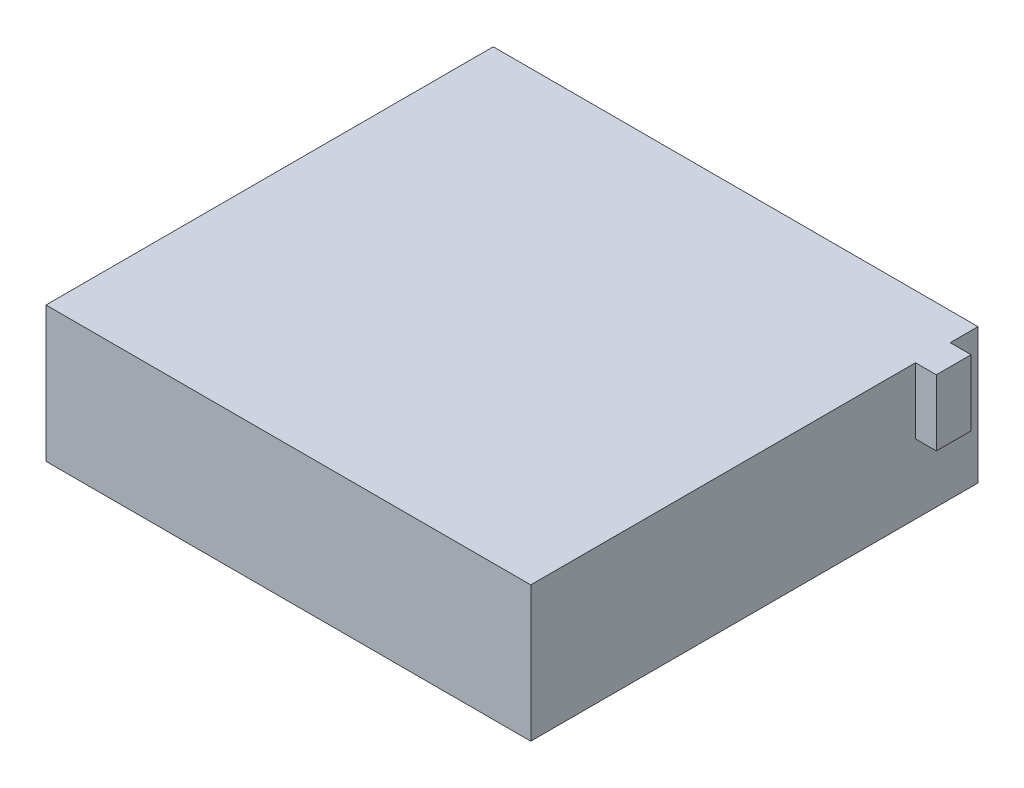
ISO-10303-21;
HEADER;
FILE_DESCRIPTION(('STEP AP214'),'2;1');
FILE_NAME('part.step','',(''),(''),'','','');
FILE_SCHEMA(('AUTOMOTIVE_DESIGN { 1 0 10303 214 1 1 1 1 }'));
ENDSEC;
DATA;
#1=APPLICATION_CONTEXT('core data for automotive mechanical design processes');
#2=APPLICATION_PROTOCOL_DEFINITION('international standard','automotive_design',2000,#1);
#3=PRODUCT_CONTEXT('',#1,'mechanical');
#4=PRODUCT('Part','Part','',(#3));
#5=PRODUCT_RELATED_PRODUCT_CATEGORY('part','',(#4));
#6=PRODUCT_DEFINITION_FORMATION('','',#4);
#7=PRODUCT_DEFINITION_CONTEXT('part definition',#1,'design');
#8=PRODUCT_DEFINITION('design','',#6,#7);
#9=PRODUCT_DEFINITION_SHAPE('','',#8);
#10=(LENGTH_UNIT() NAMED_UNIT(*) SI_UNIT(.MILLI.,.METRE.));
#11=(NAMED_UNIT(*) PLANE_ANGLE_UNIT() SI_UNIT($,.RADIAN.));
#12=(NAMED_UNIT(*) SI_UNIT($,.STERADIAN.) SOLID_ANGLE_UNIT());
#13=UNCERTAINTY_MEASURE_WITH_UNIT(LENGTH_MEASURE(1.E-05),#10,'distance_accuracy_value','');
#14=(GEOMETRIC_REPRESENTATION_CONTEXT(3) GLOBAL_UNCERTAINTY_ASSIGNED_CONTEXT((#13)) GLOBAL_UNIT_ASSIGNED_CONTEXT((#10,
#11,#12)) REPRESENTATION_CONTEXT('',''));
#15=CARTESIAN_POINT('',(0.,0.,0.));
#16=DIRECTION('',(0.,0.,1.));
#17=DIRECTION('',(1.,0.,0.));
#18=AXIS2_PLACEMENT_3D('',#15,#16,#17);
#19=CARTESIAN_POINT('',(34.9,19.5,-32.2));
#20=DIRECTION('',(-1.,0.,0.));
#21=DIRECTION('',(0.,0.,1.));
#22=AXIS2_PLACEMENT_3D('',#19,#20,#21);
#23=PLANE('',#22);
#24=DIRECTION('',(0.,-1.,0.));
#25=VECTOR('',#24,1.);
#26=CARTESIAN_POINT('',(34.9,19.5,-23.2));
#27=LINE('',#26,#25);
#28=CARTESIAN_POINT('',(34.9,19.5,-23.2));
#29=VERTEX_POINT('',#28);
#30=CARTESIAN_POINT('',(34.9,10.,-23.2));
#31=VERTEX_POINT('',#30);
#32=EDGE_CURVE('E127',#29,#31,#27,.T.);
#33=ORIENTED_EDGE('',*,*,#32,.F.);
#34=DIRECTION('',(0.,0.,-1.));
#35=VECTOR('',#34,1.);
#36=CARTESIAN_POINT('',(34.9,19.5,-32.2));
#37=LINE('',#36,#35);
#38=CARTESIAN_POINT('',(34.9,19.5,32.2));
#39=VERTEX_POINT('',#38);
#40=EDGE_CURVE('E137',#39,#29,#37,.T.);
#41=ORIENTED_EDGE('',*,*,#40,.F.);
#42=DIRECTION('',(0.,-1.,0.));
#43=VECTOR('',#42,1.);
#44=CARTESIAN_POINT('',(34.9,19.5,32.2));
#45=LINE('',#44,#43);
#46=CARTESIAN_POINT('',(34.9,0.,32.2));
#47=VERTEX_POINT('',#46);
#48=EDGE_CURVE('E145',#39,#47,#45,.T.);
#49=ORIENTED_EDGE('',*,*,#48,.T.);
#50=DIRECTION('',(0.,0.,-1.));
#51=VECTOR('',#50,1.);
#52=CARTESIAN_POINT('',(34.9,0.,-32.2));
#53=LINE('',#52,#51);
#54=CARTESIAN_POINT('',(34.9,0.,-32.2));
#55=VERTEX_POINT('',#54);
#56=EDGE_CURVE('E128',#47,#55,#53,.T.);
#57=ORIENTED_EDGE('',*,*,#56,.T.);
#58=DIRECTION('',(0.,-1.,0.));
#59=VECTOR('',#58,1.);
#60=CARTESIAN_POINT('',(34.9,19.5,-32.2));
#61=LINE('',#60,#59);
#62=CARTESIAN_POINT('',(34.9,19.5,-32.2));
#63=VERTEX_POINT('',#62);
#64=EDGE_CURVE('E11',#63,#55,#61,.T.);
#65=ORIENTED_EDGE('',*,*,#64,.F.);
#66=CARTESIAN_POINT('',(34.9,19.5,-28.2));
#67=VERTEX_POINT('',#66);
#68=EDGE_CURVE('E62',#67,#63,#37,.T.);
#69=ORIENTED_EDGE('',*,*,#68,.F.);
#70=DIRECTION('',(0.,1.,0.));
#71=VECTOR('',#70,1.);
#72=CARTESIAN_POINT('',(34.9,19.5,-28.2));
#73=LINE('',#72,#71);
#74=CARTESIAN_POINT('',(34.9,10.,-28.2));
#75=VERTEX_POINT('',#74);
#76=EDGE_CURVE('E124',#75,#67,#73,.T.);
#77=ORIENTED_EDGE('',*,*,#76,.F.);
#78=DIRECTION('',(0.,0.,-1.));
#79=VECTOR('',#78,1.);
#80=CARTESIAN_POINT('',(34.9,10.,-23.2));
#81=LINE('',#80,#79);
#82=EDGE_CURVE('E56',#31,#75,#81,.T.);
#83=ORIENTED_EDGE('',*,*,#82,.F.);
#84=EDGE_LOOP('',(#33,#41,#49,#57,#65,#69,#77,#83));
#85=FACE_BOUND('',#84,.T.);
#86=ADVANCED_FACE('F42',(#85),#23,.F.);
#87=CARTESIAN_POINT('',(-34.9,19.5,-32.2));
#88=DIRECTION('',(0.,0.,1.));
#89=DIRECTION('',(1.,0.,0.));
#90=AXIS2_PLACEMENT_3D('',#87,#88,#89);
#91=PLANE('',#90);
#92=DIRECTION('',(-1.,0.,0.));
#93=VECTOR('',#92,1.);
#94=CARTESIAN_POINT('',(-34.9,0.,-32.2));
#95=LINE('',#94,#93);
#96=CARTESIAN_POINT('',(-34.9,0.,-32.2));
#97=VERTEX_POINT('',#96);
#98=EDGE_CURVE('E131',#55,#97,#95,.T.);
#99=ORIENTED_EDGE('',*,*,#98,.T.);
#100=DIRECTION('',(0.,-1.,0.));
#101=VECTOR('',#100,1.);
#102=CARTESIAN_POINT('',(-34.9,19.5,-32.2));
#103=LINE('',#102,#101);
#104=CARTESIAN_POINT('',(-34.9,19.5,-32.2));
#105=VERTEX_POINT('',#104);
#106=EDGE_CURVE('E49',#105,#97,#103,.T.);
#107=ORIENTED_EDGE('',*,*,#106,.F.);
#108=DIRECTION('',(-1.,0.,0.));
#109=VECTOR('',#108,1.);
#110=CARTESIAN_POINT('',(-34.9,19.5,-32.2));
#111=LINE('',#110,#109);
#112=EDGE_CURVE('E140',#63,#105,#111,.T.);
#113=ORIENTED_EDGE('',*,*,#112,.F.);
#114=ORIENTED_EDGE('',*,*,#64,.T.);
#115=EDGE_LOOP('',(#99,#107,#113,#114));
#116=FACE_BOUND('',#115,.T.);
#117=ADVANCED_FACE('F187',(#116),#91,.F.);
#118=CARTESIAN_POINT('',(-34.9,19.5,-32.2));
#119=DIRECTION('',(1.,0.,0.));
#120=DIRECTION('',(0.,0.,-1.));
#121=AXIS2_PLACEMENT_3D('',#118,#119,#120);
#122=PLANE('',#121);
#123=DIRECTION('',(0.,0.,1.));
#124=VECTOR('',#123,1.);
#125=CARTESIAN_POINT('',(-34.9,0.,-32.2));
#126=LINE('',#125,#124);
#127=CARTESIAN_POINT('',(-34.9,0.,32.2));
#128=VERTEX_POINT('',#127);
#129=EDGE_CURVE('E148',#97,#128,#126,.T.);
#130=ORIENTED_EDGE('',*,*,#129,.T.);
#131=DIRECTION('',(0.,-1.,0.));
#132=VECTOR('',#131,1.);
#133=CARTESIAN_POINT('',(-34.9,19.5,32.2));
#134=LINE('',#133,#132);
#135=CARTESIAN_POINT('',(-34.9,19.5,32.2));
#136=VERTEX_POINT('',#135);
#137=EDGE_CURVE('E154',#136,#128,#134,.T.);
#138=ORIENTED_EDGE('',*,*,#137,.F.);
#139=DIRECTION('',(0.,0.,1.));
#140=VECTOR('',#139,1.);
#141=CARTESIAN_POINT('',(-34.9,19.5,-32.2));
#142=LINE('',#141,#140);
#143=EDGE_CURVE('E142',#105,#136,#142,.T.);
#144=ORIENTED_EDGE('',*,*,#143,.F.);
#145=ORIENTED_EDGE('',*,*,#106,.T.);
#146=EDGE_LOOP('',(#130,#138,#144,#145));
#147=FACE_BOUND('',#146,.T.);
#148=ADVANCED_FACE('F161',(#147),#122,.F.);
#149=CARTESIAN_POINT('',(-34.9,19.5,32.2));
#150=DIRECTION('',(0.,0.,-1.));
#151=DIRECTION('',(-1.,0.,0.));
#152=AXIS2_PLACEMENT_3D('',#149,#150,#151);
#153=PLANE('',#152);
#154=DIRECTION('',(1.,0.,0.));
#155=VECTOR('',#154,1.);
#156=CARTESIAN_POINT('',(-34.9,0.,32.2));
#157=LINE('',#156,#155);
#158=EDGE_CURVE('E150',#128,#47,#157,.T.);
#159=ORIENTED_EDGE('',*,*,#158,.T.);
#160=ORIENTED_EDGE('',*,*,#48,.F.);
#161=DIRECTION('',(1.,0.,0.));
#162=VECTOR('',#161,1.);
#163=CARTESIAN_POINT('',(-34.9,19.5,32.2));
#164=LINE('',#163,#162);
#165=EDGE_CURVE('E144',#136,#39,#164,.T.);
#166=ORIENTED_EDGE('',*,*,#165,.F.);
#167=ORIENTED_EDGE('',*,*,#137,.T.);
#168=EDGE_LOOP('',(#159,#160,#166,#167));
#169=FACE_BOUND('',#168,.T.);
#170=ADVANCED_FACE('F171',(#169),#153,.F.);
#171=CARTESIAN_POINT('',(0.,19.5,0.));
#172=DIRECTION('',(0.,1.,0.));
#173=DIRECTION('',(0.,0.,1.));
#174=AXIS2_PLACEMENT_3D('',#171,#172,#173);
#175=PLANE('',#174);
#176=ORIENTED_EDGE('',*,*,#40,.T.);
#177=DIRECTION('',(-1.,0.,0.));
#178=VECTOR('',#177,1.);
#179=CARTESIAN_POINT('',(37.9,19.5,-23.2));
#180=LINE('',#179,#178);
#181=CARTESIAN_POINT('',(37.9,19.5,-23.2));
#182=VERTEX_POINT('',#181);
#183=EDGE_CURVE('E176',#182,#29,#180,.T.);
#184=ORIENTED_EDGE('',*,*,#183,.F.);
#185=DIRECTION('',(0.,0.,1.));
#186=VECTOR('',#185,1.);
#187=CARTESIAN_POINT('',(37.9,19.5,-23.2));
#188=LINE('',#187,#186);
#189=CARTESIAN_POINT('',(37.9,19.5,-28.2));
#190=VERTEX_POINT('',#189);
#191=EDGE_CURVE('E120',#190,#182,#188,.T.);
#192=ORIENTED_EDGE('',*,*,#191,.F.);
#193=DIRECTION('',(-1.,0.,0.));
#194=VECTOR('',#193,1.);
#195=CARTESIAN_POINT('',(37.9,19.5,-28.2));
#196=LINE('',#195,#194);
#197=EDGE_CURVE('E133',#190,#67,#196,.T.);
#198=ORIENTED_EDGE('',*,*,#197,.T.);
#199=ORIENTED_EDGE('',*,*,#68,.T.);
#200=ORIENTED_EDGE('',*,*,#112,.T.);
#201=ORIENTED_EDGE('',*,*,#143,.T.);
#202=ORIENTED_EDGE('',*,*,#165,.T.);
#203=EDGE_LOOP('',(#176,#184,#192,#198,#199,#200,#201,#202));
#204=FACE_BOUND('',#203,.T.);
#205=ADVANCED_FACE('F175',(#204),#175,.T.);
#206=CARTESIAN_POINT('',(0.,0.,0.));
#207=DIRECTION('',(0.,1.,0.));
#208=DIRECTION('',(0.,0.,1.));
#209=AXIS2_PLACEMENT_3D('',#206,#207,#208);
#210=PLANE('',#209);
#211=ORIENTED_EDGE('',*,*,#56,.F.);
#212=ORIENTED_EDGE('',*,*,#158,.F.);
#213=ORIENTED_EDGE('',*,*,#129,.F.);
#214=ORIENTED_EDGE('',*,*,#98,.F.);
#215=EDGE_LOOP('',(#211,#212,#213,#214));
#216=FACE_BOUND('',#215,.T.);
#217=ADVANCED_FACE('F168',(#216),#210,.F.);
#218=CARTESIAN_POINT('',(37.9,19.5,-23.2));
#219=DIRECTION('',(0.,0.,-1.));
#220=DIRECTION('',(-1.,0.,0.));
#221=AXIS2_PLACEMENT_3D('',#218,#219,#220);
#222=PLANE('',#221);
#223=ORIENTED_EDGE('',*,*,#32,.T.);
#224=DIRECTION('',(-1.,0.,0.));
#225=VECTOR('',#224,1.);
#226=CARTESIAN_POINT('',(37.9,10.,-23.2));
#227=LINE('',#226,#225);
#228=CARTESIAN_POINT('',(37.9,10.,-23.2));
#229=VERTEX_POINT('',#228);
#230=EDGE_CURVE('E108',#229,#31,#227,.T.);
#231=ORIENTED_EDGE('',*,*,#230,.F.);
#232=DIRECTION('',(0.,-1.,0.));
#233=VECTOR('',#232,1.);
#234=CARTESIAN_POINT('',(37.9,19.5,-23.2));
#235=LINE('',#234,#233);
#236=EDGE_CURVE('E115',#182,#229,#235,.T.);
#237=ORIENTED_EDGE('',*,*,#236,.F.);
#238=ORIENTED_EDGE('',*,*,#183,.T.);
#239=EDGE_LOOP('',(#223,#231,#237,#238));
#240=FACE_BOUND('',#239,.T.);
#241=ADVANCED_FACE('F126',(#240),#222,.F.);
#242=CARTESIAN_POINT('',(37.9,10.,-23.2));
#243=DIRECTION('',(0.,1.,0.));
#244=DIRECTION('',(0.,0.,1.));
#245=AXIS2_PLACEMENT_3D('',#242,#243,#244);
#246=PLANE('',#245);
#247=ORIENTED_EDGE('',*,*,#82,.T.);
#248=DIRECTION('',(-1.,0.,0.));
#249=VECTOR('',#248,1.);
#250=CARTESIAN_POINT('',(37.9,10.,-28.2));
#251=LINE('',#250,#249);
#252=CARTESIAN_POINT('',(37.9,10.,-28.2));
#253=VERTEX_POINT('',#252);
#254=EDGE_CURVE('E111',#253,#75,#251,.T.);
#255=ORIENTED_EDGE('',*,*,#254,.F.);
#256=DIRECTION('',(0.,0.,-1.));
#257=VECTOR('',#256,1.);
#258=CARTESIAN_POINT('',(37.9,10.,-23.2));
#259=LINE('',#258,#257);
#260=EDGE_CURVE('E104',#229,#253,#259,.T.);
#261=ORIENTED_EDGE('',*,*,#260,.F.);
#262=ORIENTED_EDGE('',*,*,#230,.T.);
#263=EDGE_LOOP('',(#247,#255,#261,#262));
#264=FACE_BOUND('',#263,.T.);
#265=ADVANCED_FACE('F106',(#264),#246,.F.);
#266=CARTESIAN_POINT('',(37.9,19.5,-28.2));
#267=DIRECTION('',(0.,0.,1.));
#268=DIRECTION('',(0.,-1.,0.));
#269=AXIS2_PLACEMENT_3D('',#266,#267,#268);
#270=PLANE('',#269);
#271=ORIENTED_EDGE('',*,*,#76,.T.);
#272=ORIENTED_EDGE('',*,*,#197,.F.);
#273=DIRECTION('',(0.,1.,0.));
#274=VECTOR('',#273,1.);
#275=CARTESIAN_POINT('',(37.9,19.5,-28.2));
#276=LINE('',#275,#274);
#277=EDGE_CURVE('E114',#253,#190,#276,.T.);
#278=ORIENTED_EDGE('',*,*,#277,.F.);
#279=ORIENTED_EDGE('',*,*,#254,.T.);
#280=EDGE_LOOP('',(#271,#272,#278,#279));
#281=FACE_BOUND('',#280,.T.);
#282=ADVANCED_FACE('F186',(#281),#270,.F.);
#283=CARTESIAN_POINT('',(37.9,0.,0.));
#284=DIRECTION('',(1.,0.,0.));
#285=DIRECTION('',(0.,0.,-1.));
#286=AXIS2_PLACEMENT_3D('',#283,#284,#285);
#287=PLANE('',#286);
#288=ORIENTED_EDGE('',*,*,#236,.T.);
#289=ORIENTED_EDGE('',*,*,#260,.T.);
#290=ORIENTED_EDGE('',*,*,#277,.T.);
#291=ORIENTED_EDGE('',*,*,#191,.T.);
#292=EDGE_LOOP('',(#288,#289,#290,#291));
#293=FACE_BOUND('',#292,.T.);
#294=ADVANCED_FACE('F118',(#293),#287,.T.);
#295=CLOSED_SHELL('',(#86,#117,#148,#170,#205,#217,#241,#265,#282,#294));
#296=MANIFOLD_SOLID_BREP('B2',#295);
#297=ADVANCED_BREP_SHAPE_REPRESENTATION('',(#18,#296),#14);
#298=SHAPE_DEFINITION_REPRESENTATION(#9,#297);
ENDSEC;
END-ISO-10303-21;
